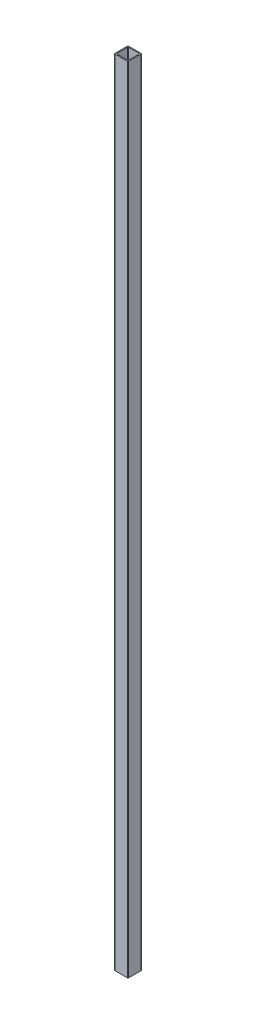
ISO-10303-21;
HEADER;
FILE_DESCRIPTION(('STEP AP214'),'2;1');
FILE_NAME('part.step','',(''),(''),'','','');
FILE_SCHEMA(('AUTOMOTIVE_DESIGN { 1 0 10303 214 1 1 1 1 }'));
ENDSEC;
DATA;
#1=APPLICATION_CONTEXT('core data for automotive mechanical design processes');
#2=APPLICATION_PROTOCOL_DEFINITION('international standard','automotive_design',2000,#1);
#3=PRODUCT_CONTEXT('',#1,'mechanical');
#4=PRODUCT('Part','Part','',(#3));
#5=PRODUCT_RELATED_PRODUCT_CATEGORY('part','',(#4));
#6=PRODUCT_DEFINITION_FORMATION('','',#4);
#7=PRODUCT_DEFINITION_CONTEXT('part definition',#1,'design');
#8=PRODUCT_DEFINITION('design','',#6,#7);
#9=PRODUCT_DEFINITION_SHAPE('','',#8);
#10=(LENGTH_UNIT() NAMED_UNIT(*) SI_UNIT(.MILLI.,.METRE.));
#11=(NAMED_UNIT(*) PLANE_ANGLE_UNIT() SI_UNIT($,.RADIAN.));
#12=(NAMED_UNIT(*) SI_UNIT($,.STERADIAN.) SOLID_ANGLE_UNIT());
#13=UNCERTAINTY_MEASURE_WITH_UNIT(LENGTH_MEASURE(1.E-05),#10,'distance_accuracy_value','');
#14=(GEOMETRIC_REPRESENTATION_CONTEXT(3) GLOBAL_UNCERTAINTY_ASSIGNED_CONTEXT((#13)) GLOBAL_UNIT_ASSIGNED_CONTEXT((#10,
#11,#12)) REPRESENTATION_CONTEXT('',''));
#15=CARTESIAN_POINT('',(0.,0.,0.));
#16=DIRECTION('',(0.,0.,1.));
#17=DIRECTION('',(1.,0.,0.));
#18=AXIS2_PLACEMENT_3D('',#15,#16,#17);
#19=CARTESIAN_POINT('',(-9.,1160.,9.));
#20=DIRECTION('',(0.,-1.,0.));
#21=DIRECTION('',(0.,0.,-1.));
#22=AXIS2_PLACEMENT_3D('',#19,#20,#21);
#23=PLANE('',#22);
#24=CARTESIAN_POINT('',(-9.,1160.,9.));
#25=DIRECTION('',(0.,1.,0.));
#26=DIRECTION('',(0.,0.,-1.));
#27=AXIS2_PLACEMENT_3D('',#24,#25,#26);
#28=CIRCLE('',#27,0.999999999999999);
#29=CARTESIAN_POINT('',(-10.,1160.,8.99999999999999));
#30=VERTEX_POINT('',#29);
#31=CARTESIAN_POINT('',(-8.99999999999999,1160.,10.));
#32=VERTEX_POINT('',#31);
#33=EDGE_CURVE('E213',#30,#32,#28,.T.);
#34=ORIENTED_EDGE('',*,*,#33,.T.);
#35=DIRECTION('',(1.,0.,0.));
#36=VECTOR('',#35,1.);
#37=CARTESIAN_POINT('',(-8.99999999999999,1160.,10.));
#38=LINE('',#37,#36);
#39=CARTESIAN_POINT('',(8.99999999999999,1160.,10.));
#40=VERTEX_POINT('',#39);
#41=EDGE_CURVE('E216',#32,#40,#38,.T.);
#42=ORIENTED_EDGE('',*,*,#41,.T.);
#43=CARTESIAN_POINT('',(9.,1160.,9.));
#44=DIRECTION('',(0.,1.,0.));
#45=DIRECTION('',(0.,0.,1.));
#46=AXIS2_PLACEMENT_3D('',#43,#44,#45);
#47=CIRCLE('',#46,0.999999999999999);
#48=CARTESIAN_POINT('',(10.,1160.,8.99999999999999));
#49=VERTEX_POINT('',#48);
#50=EDGE_CURVE('E219',#40,#49,#47,.T.);
#51=ORIENTED_EDGE('',*,*,#50,.T.);
#52=DIRECTION('',(0.,0.,-1.));
#53=VECTOR('',#52,1.);
#54=CARTESIAN_POINT('',(10.,1160.,8.99999999999999));
#55=LINE('',#54,#53);
#56=CARTESIAN_POINT('',(10.,1160.,-8.99999999999999));
#57=VERTEX_POINT('',#56);
#58=EDGE_CURVE('E221',#49,#57,#55,.T.);
#59=ORIENTED_EDGE('',*,*,#58,.T.);
#60=CARTESIAN_POINT('',(9.,1160.,-9.));
#61=DIRECTION('',(0.,1.,0.));
#62=DIRECTION('',(0.,0.,-1.));
#63=AXIS2_PLACEMENT_3D('',#60,#61,#62);
#64=CIRCLE('',#63,0.999999999999999);
#65=CARTESIAN_POINT('',(8.99999999999999,1160.,-10.));
#66=VERTEX_POINT('',#65);
#67=EDGE_CURVE('E223',#57,#66,#64,.T.);
#68=ORIENTED_EDGE('',*,*,#67,.T.);
#69=DIRECTION('',(-1.,0.,0.));
#70=VECTOR('',#69,1.);
#71=CARTESIAN_POINT('',(-8.99999999999999,1160.,-10.));
#72=LINE('',#71,#70);
#73=CARTESIAN_POINT('',(-8.99999999999999,1160.,-10.));
#74=VERTEX_POINT('',#73);
#75=EDGE_CURVE('E225',#66,#74,#72,.T.);
#76=ORIENTED_EDGE('',*,*,#75,.T.);
#77=CARTESIAN_POINT('',(-9.,1160.,-9.));
#78=DIRECTION('',(0.,1.,0.));
#79=DIRECTION('',(0.,0.,-1.));
#80=AXIS2_PLACEMENT_3D('',#77,#78,#79);
#81=CIRCLE('',#80,0.999999999999999);
#82=CARTESIAN_POINT('',(-10.,1160.,-8.99999999999999));
#83=VERTEX_POINT('',#82);
#84=EDGE_CURVE('E227',#74,#83,#81,.T.);
#85=ORIENTED_EDGE('',*,*,#84,.T.);
#86=DIRECTION('',(0.,0.,1.));
#87=VECTOR('',#86,1.);
#88=CARTESIAN_POINT('',(-10.,1160.,8.99999999999999));
#89=LINE('',#88,#87);
#90=EDGE_CURVE('E229',#83,#30,#89,.T.);
#91=ORIENTED_EDGE('',*,*,#90,.T.);
#92=EDGE_LOOP('',(#34,#42,#51,#59,#68,#76,#85,#91));
#93=FACE_BOUND('',#92,.T.);
#94=CARTESIAN_POINT('',(-7.5,1160.,7.5));
#95=DIRECTION('',(0.,1.,0.));
#96=DIRECTION('',(0.,0.,-1.));
#97=AXIS2_PLACEMENT_3D('',#94,#95,#96);
#98=CIRCLE('',#97,1.);
#99=CARTESIAN_POINT('',(-8.5,1160.,7.49999999999999));
#100=VERTEX_POINT('',#99);
#101=CARTESIAN_POINT('',(-7.5,1160.,8.5));
#102=VERTEX_POINT('',#101);
#103=EDGE_CURVE('E148',#100,#102,#98,.T.);
#104=ORIENTED_EDGE('',*,*,#103,.F.);
#105=DIRECTION('',(0.,0.,1.));
#106=VECTOR('',#105,1.);
#107=CARTESIAN_POINT('',(-8.5,1160.,7.49999999999999));
#108=LINE('',#107,#106);
#109=CARTESIAN_POINT('',(-8.5,1160.,-7.49999999999999));
#110=VERTEX_POINT('',#109);
#111=EDGE_CURVE('E181',#110,#100,#108,.T.);
#112=ORIENTED_EDGE('',*,*,#111,.F.);
#113=CARTESIAN_POINT('',(-7.5,1160.,-7.5));
#114=DIRECTION('',(0.,1.,0.));
#115=DIRECTION('',(0.,0.,-1.));
#116=AXIS2_PLACEMENT_3D('',#113,#114,#115);
#117=CIRCLE('',#116,1.);
#118=CARTESIAN_POINT('',(-7.5,1160.,-8.5));
#119=VERTEX_POINT('',#118);
#120=EDGE_CURVE('E179',#119,#110,#117,.T.);
#121=ORIENTED_EDGE('',*,*,#120,.F.);
#122=DIRECTION('',(-1.,0.,0.));
#123=VECTOR('',#122,1.);
#124=CARTESIAN_POINT('',(-7.5,1160.,-8.5));
#125=LINE('',#124,#123);
#126=CARTESIAN_POINT('',(7.49999999999999,1160.,-8.5));
#127=VERTEX_POINT('',#126);
#128=EDGE_CURVE('E177',#127,#119,#125,.T.);
#129=ORIENTED_EDGE('',*,*,#128,.F.);
#130=CARTESIAN_POINT('',(7.5,1160.,-7.5));
#131=DIRECTION('',(0.,1.,0.));
#132=DIRECTION('',(0.,0.,-1.));
#133=AXIS2_PLACEMENT_3D('',#130,#131,#132);
#134=CIRCLE('',#133,1.);
#135=CARTESIAN_POINT('',(8.5,1160.,-7.49999999999999));
#136=VERTEX_POINT('',#135);
#137=EDGE_CURVE('E175',#136,#127,#134,.T.);
#138=ORIENTED_EDGE('',*,*,#137,.F.);
#139=DIRECTION('',(0.,0.,-1.));
#140=VECTOR('',#139,1.);
#141=CARTESIAN_POINT('',(8.5,1160.,7.49999999999999));
#142=LINE('',#141,#140);
#143=CARTESIAN_POINT('',(8.5,1160.,7.49999999999999));
#144=VERTEX_POINT('',#143);
#145=EDGE_CURVE('E171',#144,#136,#142,.T.);
#146=ORIENTED_EDGE('',*,*,#145,.F.);
#147=CARTESIAN_POINT('',(7.5,1160.,7.5));
#148=DIRECTION('',(0.,1.,0.));
#149=DIRECTION('',(0.,0.,1.));
#150=AXIS2_PLACEMENT_3D('',#147,#148,#149);
#151=CIRCLE('',#150,1.);
#152=CARTESIAN_POINT('',(7.49999999999999,1160.,8.5));
#153=VERTEX_POINT('',#152);
#154=EDGE_CURVE('E169',#153,#144,#151,.T.);
#155=ORIENTED_EDGE('',*,*,#154,.F.);
#156=DIRECTION('',(1.,0.,0.));
#157=VECTOR('',#156,1.);
#158=CARTESIAN_POINT('',(-7.5,1160.,8.5));
#159=LINE('',#158,#157);
#160=EDGE_CURVE('E156',#102,#153,#159,.T.);
#161=ORIENTED_EDGE('',*,*,#160,.F.);
#162=EDGE_LOOP('',(#104,#112,#121,#129,#138,#146,#155,#161));
#163=FACE_BOUND('',#162,.T.);
#164=ADVANCED_FACE('F35',(#93,#163),#23,.F.);
#165=CARTESIAN_POINT('',(-9.,0.,9.));
#166=DIRECTION('',(0.,-1.,0.));
#167=DIRECTION('',(0.,0.,-1.));
#168=AXIS2_PLACEMENT_3D('',#165,#166,#167);
#169=PLANE('',#168);
#170=CARTESIAN_POINT('',(-9.,0.,9.));
#171=DIRECTION('',(0.,1.,0.));
#172=DIRECTION('',(0.,0.,-1.));
#173=AXIS2_PLACEMENT_3D('',#170,#171,#172);
#174=CIRCLE('',#173,0.999999999999999);
#175=CARTESIAN_POINT('',(-10.,0.,8.99999999999999));
#176=VERTEX_POINT('',#175);
#177=CARTESIAN_POINT('',(-8.99999999999999,0.,10.));
#178=VERTEX_POINT('',#177);
#179=EDGE_CURVE('E164',#176,#178,#174,.T.);
#180=ORIENTED_EDGE('',*,*,#179,.F.);
#181=DIRECTION('',(0.,0.,1.));
#182=VECTOR('',#181,1.);
#183=CARTESIAN_POINT('',(-10.,0.,8.99999999999999));
#184=LINE('',#183,#182);
#185=CARTESIAN_POINT('',(-10.,0.,-8.99999999999999));
#186=VERTEX_POINT('',#185);
#187=EDGE_CURVE('E217',#186,#176,#184,.T.);
#188=ORIENTED_EDGE('',*,*,#187,.F.);
#189=CARTESIAN_POINT('',(-9.,0.,-9.));
#190=DIRECTION('',(0.,1.,0.));
#191=DIRECTION('',(0.,0.,-1.));
#192=AXIS2_PLACEMENT_3D('',#189,#190,#191);
#193=CIRCLE('',#192,0.999999999999999);
#194=CARTESIAN_POINT('',(-8.99999999999999,0.,-10.));
#195=VERTEX_POINT('',#194);
#196=EDGE_CURVE('E244',#195,#186,#193,.T.);
#197=ORIENTED_EDGE('',*,*,#196,.F.);
#198=DIRECTION('',(-1.,0.,0.));
#199=VECTOR('',#198,1.);
#200=CARTESIAN_POINT('',(-8.99999999999999,0.,-10.));
#201=LINE('',#200,#199);
#202=CARTESIAN_POINT('',(8.99999999999999,0.,-10.));
#203=VERTEX_POINT('',#202);
#204=EDGE_CURVE('E242',#203,#195,#201,.T.);
#205=ORIENTED_EDGE('',*,*,#204,.F.);
#206=CARTESIAN_POINT('',(9.,0.,-9.));
#207=DIRECTION('',(0.,1.,0.));
#208=DIRECTION('',(0.,0.,-1.));
#209=AXIS2_PLACEMENT_3D('',#206,#207,#208);
#210=CIRCLE('',#209,0.999999999999999);
#211=CARTESIAN_POINT('',(10.,0.,-8.99999999999999));
#212=VERTEX_POINT('',#211);
#213=EDGE_CURVE('E240',#212,#203,#210,.T.);
#214=ORIENTED_EDGE('',*,*,#213,.F.);
#215=DIRECTION('',(0.,0.,-1.));
#216=VECTOR('',#215,1.);
#217=CARTESIAN_POINT('',(10.,0.,8.99999999999999));
#218=LINE('',#217,#216);
#219=CARTESIAN_POINT('',(10.,0.,8.99999999999999));
#220=VERTEX_POINT('',#219);
#221=EDGE_CURVE('E238',#220,#212,#218,.T.);
#222=ORIENTED_EDGE('',*,*,#221,.F.);
#223=CARTESIAN_POINT('',(9.,0.,9.));
#224=DIRECTION('',(0.,1.,0.));
#225=DIRECTION('',(0.,0.,1.));
#226=AXIS2_PLACEMENT_3D('',#223,#224,#225);
#227=CIRCLE('',#226,0.999999999999999);
#228=CARTESIAN_POINT('',(8.99999999999999,0.,10.));
#229=VERTEX_POINT('',#228);
#230=EDGE_CURVE('E236',#229,#220,#227,.T.);
#231=ORIENTED_EDGE('',*,*,#230,.F.);
#232=DIRECTION('',(1.,0.,0.));
#233=VECTOR('',#232,1.);
#234=CARTESIAN_POINT('',(-8.99999999999999,0.,10.));
#235=LINE('',#234,#233);
#236=EDGE_CURVE('E234',#178,#229,#235,.T.);
#237=ORIENTED_EDGE('',*,*,#236,.F.);
#238=EDGE_LOOP('',(#180,#188,#197,#205,#214,#222,#231,#237));
#239=FACE_BOUND('',#238,.T.);
#240=DIRECTION('',(0.,0.,1.));
#241=VECTOR('',#240,1.);
#242=CARTESIAN_POINT('',(-8.5,0.,7.49999999999999));
#243=LINE('',#242,#241);
#244=CARTESIAN_POINT('',(-8.5,0.,-7.49999999999999));
#245=VERTEX_POINT('',#244);
#246=CARTESIAN_POINT('',(-8.5,0.,7.49999999999999));
#247=VERTEX_POINT('',#246);
#248=EDGE_CURVE('E157',#245,#247,#243,.T.);
#249=ORIENTED_EDGE('',*,*,#248,.T.);
#250=CARTESIAN_POINT('',(-7.5,0.,7.5));
#251=DIRECTION('',(0.,1.,0.));
#252=DIRECTION('',(0.,0.,-1.));
#253=AXIS2_PLACEMENT_3D('',#250,#251,#252);
#254=CIRCLE('',#253,1.);
#255=CARTESIAN_POINT('',(-7.5,0.,8.5));
#256=VERTEX_POINT('',#255);
#257=EDGE_CURVE('E58',#247,#256,#254,.T.);
#258=ORIENTED_EDGE('',*,*,#257,.T.);
#259=DIRECTION('',(1.,0.,0.));
#260=VECTOR('',#259,1.);
#261=CARTESIAN_POINT('',(-7.5,0.,8.5));
#262=LINE('',#261,#260);
#263=CARTESIAN_POINT('',(7.49999999999999,0.,8.5));
#264=VERTEX_POINT('',#263);
#265=EDGE_CURVE('E163',#256,#264,#262,.T.);
#266=ORIENTED_EDGE('',*,*,#265,.T.);
#267=CARTESIAN_POINT('',(7.5,0.,7.5));
#268=DIRECTION('',(0.,1.,0.));
#269=DIRECTION('',(0.,0.,1.));
#270=AXIS2_PLACEMENT_3D('',#267,#268,#269);
#271=CIRCLE('',#270,1.);
#272=CARTESIAN_POINT('',(8.5,0.,7.49999999999999));
#273=VERTEX_POINT('',#272);
#274=EDGE_CURVE('E185',#264,#273,#271,.T.);
#275=ORIENTED_EDGE('',*,*,#274,.T.);
#276=DIRECTION('',(0.,0.,-1.));
#277=VECTOR('',#276,1.);
#278=CARTESIAN_POINT('',(8.5,0.,7.49999999999999));
#279=LINE('',#278,#277);
#280=CARTESIAN_POINT('',(8.5,0.,-7.49999999999999));
#281=VERTEX_POINT('',#280);
#282=EDGE_CURVE('E188',#273,#281,#279,.T.);
#283=ORIENTED_EDGE('',*,*,#282,.T.);
#284=CARTESIAN_POINT('',(7.5,0.,-7.5));
#285=DIRECTION('',(0.,1.,0.));
#286=DIRECTION('',(0.,0.,-1.));
#287=AXIS2_PLACEMENT_3D('',#284,#285,#286);
#288=CIRCLE('',#287,1.);
#289=CARTESIAN_POINT('',(7.49999999999999,0.,-8.5));
#290=VERTEX_POINT('',#289);
#291=EDGE_CURVE('E191',#281,#290,#288,.T.);
#292=ORIENTED_EDGE('',*,*,#291,.T.);
#293=DIRECTION('',(-1.,0.,0.));
#294=VECTOR('',#293,1.);
#295=CARTESIAN_POINT('',(-7.5,0.,-8.5));
#296=LINE('',#295,#294);
#297=CARTESIAN_POINT('',(-7.5,0.,-8.5));
#298=VERTEX_POINT('',#297);
#299=EDGE_CURVE('E194',#290,#298,#296,.T.);
#300=ORIENTED_EDGE('',*,*,#299,.T.);
#301=CARTESIAN_POINT('',(-7.5,0.,-7.5));
#302=DIRECTION('',(0.,1.,0.));
#303=DIRECTION('',(0.,0.,-1.));
#304=AXIS2_PLACEMENT_3D('',#301,#302,#303);
#305=CIRCLE('',#304,1.);
#306=EDGE_CURVE('E197',#298,#245,#305,.T.);
#307=ORIENTED_EDGE('',*,*,#306,.T.);
#308=EDGE_LOOP('',(#249,#258,#266,#275,#283,#292,#300,#307));
#309=FACE_BOUND('',#308,.T.);
#310=ADVANCED_FACE('F274',(#239,#309),#169,.T.);
#311=CARTESIAN_POINT('',(-9.,1160.,9.));
#312=DIRECTION('',(0.,-1.,0.));
#313=DIRECTION('',(0.,0.,-1.));
#314=AXIS2_PLACEMENT_3D('',#311,#312,#313);
#315=CYLINDRICAL_SURFACE('',#314,0.999999999999999);
#316=ORIENTED_EDGE('',*,*,#179,.T.);
#317=DIRECTION('',(0.,-1.,0.));
#318=VECTOR('',#317,1.);
#319=CARTESIAN_POINT('',(-8.99999999999999,1160.,10.));
#320=LINE('',#319,#318);
#321=EDGE_CURVE('E11',#32,#178,#320,.T.);
#322=ORIENTED_EDGE('',*,*,#321,.F.);
#323=ORIENTED_EDGE('',*,*,#33,.F.);
#324=DIRECTION('',(0.,-1.,0.));
#325=VECTOR('',#324,1.);
#326=CARTESIAN_POINT('',(-10.,1160.,8.99999999999999));
#327=LINE('',#326,#325);
#328=EDGE_CURVE('E231',#30,#176,#327,.T.);
#329=ORIENTED_EDGE('',*,*,#328,.T.);
#330=EDGE_LOOP('',(#316,#322,#323,#329));
#331=FACE_BOUND('',#330,.T.);
#332=ADVANCED_FACE('F37',(#331),#315,.T.);
#333=CARTESIAN_POINT('',(-8.99999999999999,1160.,10.));
#334=DIRECTION('',(0.,0.,-1.));
#335=DIRECTION('',(-1.,0.,0.));
#336=AXIS2_PLACEMENT_3D('',#333,#334,#335);
#337=PLANE('',#336);
#338=ORIENTED_EDGE('',*,*,#236,.T.);
#339=DIRECTION('',(0.,-1.,0.));
#340=VECTOR('',#339,1.);
#341=CARTESIAN_POINT('',(8.99999999999999,1160.,10.));
#342=LINE('',#341,#340);
#343=EDGE_CURVE('E43',#40,#229,#342,.T.);
#344=ORIENTED_EDGE('',*,*,#343,.F.);
#345=ORIENTED_EDGE('',*,*,#41,.F.);
#346=ORIENTED_EDGE('',*,*,#321,.T.);
#347=EDGE_LOOP('',(#338,#344,#345,#346));
#348=FACE_BOUND('',#347,.T.);
#349=ADVANCED_FACE('F291',(#348),#337,.F.);
#350=CARTESIAN_POINT('',(9.,1160.,9.));
#351=DIRECTION('',(0.,-1.,0.));
#352=DIRECTION('',(0.,0.,-1.));
#353=AXIS2_PLACEMENT_3D('',#350,#351,#352);
#354=CYLINDRICAL_SURFACE('',#353,0.999999999999999);
#355=ORIENTED_EDGE('',*,*,#230,.T.);
#356=DIRECTION('',(0.,-1.,0.));
#357=VECTOR('',#356,1.);
#358=CARTESIAN_POINT('',(10.,1160.,8.99999999999999));
#359=LINE('',#358,#357);
#360=EDGE_CURVE('E261',#49,#220,#359,.T.);
#361=ORIENTED_EDGE('',*,*,#360,.F.);
#362=ORIENTED_EDGE('',*,*,#50,.F.);
#363=ORIENTED_EDGE('',*,*,#343,.T.);
#364=EDGE_LOOP('',(#355,#361,#362,#363));
#365=FACE_BOUND('',#364,.T.);
#366=ADVANCED_FACE('F268',(#365),#354,.T.);
#367=CARTESIAN_POINT('',(10.,1160.,8.99999999999999));
#368=DIRECTION('',(-1.,0.,0.));
#369=DIRECTION('',(0.,0.,1.));
#370=AXIS2_PLACEMENT_3D('',#367,#368,#369);
#371=PLANE('',#370);
#372=ORIENTED_EDGE('',*,*,#221,.T.);
#373=DIRECTION('',(0.,-1.,0.));
#374=VECTOR('',#373,1.);
#375=CARTESIAN_POINT('',(10.,1160.,-8.99999999999999));
#376=LINE('',#375,#374);
#377=EDGE_CURVE('E258',#57,#212,#376,.T.);
#378=ORIENTED_EDGE('',*,*,#377,.F.);
#379=ORIENTED_EDGE('',*,*,#58,.F.);
#380=ORIENTED_EDGE('',*,*,#360,.T.);
#381=EDGE_LOOP('',(#372,#378,#379,#380));
#382=FACE_BOUND('',#381,.T.);
#383=ADVANCED_FACE('F280',(#382),#371,.F.);
#384=CARTESIAN_POINT('',(9.,1160.,-9.));
#385=DIRECTION('',(0.,-1.,0.));
#386=DIRECTION('',(0.,0.,-1.));
#387=AXIS2_PLACEMENT_3D('',#384,#385,#386);
#388=CYLINDRICAL_SURFACE('',#387,0.999999999999999);
#389=ORIENTED_EDGE('',*,*,#213,.T.);
#390=DIRECTION('',(0.,-1.,0.));
#391=VECTOR('',#390,1.);
#392=CARTESIAN_POINT('',(8.99999999999999,1160.,-10.));
#393=LINE('',#392,#391);
#394=EDGE_CURVE('E255',#66,#203,#393,.T.);
#395=ORIENTED_EDGE('',*,*,#394,.F.);
#396=ORIENTED_EDGE('',*,*,#67,.F.);
#397=ORIENTED_EDGE('',*,*,#377,.T.);
#398=EDGE_LOOP('',(#389,#395,#396,#397));
#399=FACE_BOUND('',#398,.T.);
#400=ADVANCED_FACE('F284',(#399),#388,.T.);
#401=CARTESIAN_POINT('',(-8.99999999999999,1160.,-10.));
#402=DIRECTION('',(0.,0.,1.));
#403=DIRECTION('',(1.,0.,0.));
#404=AXIS2_PLACEMENT_3D('',#401,#402,#403);
#405=PLANE('',#404);
#406=ORIENTED_EDGE('',*,*,#204,.T.);
#407=DIRECTION('',(0.,-1.,0.));
#408=VECTOR('',#407,1.);
#409=CARTESIAN_POINT('',(-8.99999999999999,1160.,-10.));
#410=LINE('',#409,#408);
#411=EDGE_CURVE('E252',#74,#195,#410,.T.);
#412=ORIENTED_EDGE('',*,*,#411,.F.);
#413=ORIENTED_EDGE('',*,*,#75,.F.);
#414=ORIENTED_EDGE('',*,*,#394,.T.);
#415=EDGE_LOOP('',(#406,#412,#413,#414));
#416=FACE_BOUND('',#415,.T.);
#417=ADVANCED_FACE('F304',(#416),#405,.F.);
#418=CARTESIAN_POINT('',(-9.,1160.,-9.));
#419=DIRECTION('',(0.,-1.,0.));
#420=DIRECTION('',(0.,0.,-1.));
#421=AXIS2_PLACEMENT_3D('',#418,#419,#420);
#422=CYLINDRICAL_SURFACE('',#421,0.999999999999999);
#423=ORIENTED_EDGE('',*,*,#196,.T.);
#424=DIRECTION('',(0.,-1.,0.));
#425=VECTOR('',#424,1.);
#426=CARTESIAN_POINT('',(-10.,1160.,-8.99999999999999));
#427=LINE('',#426,#425);
#428=EDGE_CURVE('E249',#83,#186,#427,.T.);
#429=ORIENTED_EDGE('',*,*,#428,.F.);
#430=ORIENTED_EDGE('',*,*,#84,.F.);
#431=ORIENTED_EDGE('',*,*,#411,.T.);
#432=EDGE_LOOP('',(#423,#429,#430,#431));
#433=FACE_BOUND('',#432,.T.);
#434=ADVANCED_FACE('F302',(#433),#422,.T.);
#435=CARTESIAN_POINT('',(-10.,1160.,8.99999999999999));
#436=DIRECTION('',(1.,0.,0.));
#437=DIRECTION('',(0.,0.,-1.));
#438=AXIS2_PLACEMENT_3D('',#435,#436,#437);
#439=PLANE('',#438);
#440=ORIENTED_EDGE('',*,*,#187,.T.);
#441=ORIENTED_EDGE('',*,*,#328,.F.);
#442=ORIENTED_EDGE('',*,*,#90,.F.);
#443=ORIENTED_EDGE('',*,*,#428,.T.);
#444=EDGE_LOOP('',(#440,#441,#442,#443));
#445=FACE_BOUND('',#444,.T.);
#446=ADVANCED_FACE('F297',(#445),#439,.F.);
#447=CARTESIAN_POINT('',(-7.5,1160.,7.5));
#448=DIRECTION('',(0.,-1.,0.));
#449=DIRECTION('',(0.,0.,-1.));
#450=AXIS2_PLACEMENT_3D('',#447,#448,#449);
#451=CYLINDRICAL_SURFACE('',#450,1.);
#452=ORIENTED_EDGE('',*,*,#257,.F.);
#453=DIRECTION('',(0.,-1.,0.));
#454=VECTOR('',#453,1.);
#455=CARTESIAN_POINT('',(-8.5,1160.,7.49999999999999));
#456=LINE('',#455,#454);
#457=EDGE_CURVE('E152',#100,#247,#456,.T.);
#458=ORIENTED_EDGE('',*,*,#457,.F.);
#459=ORIENTED_EDGE('',*,*,#103,.T.);
#460=DIRECTION('',(0.,-1.,0.));
#461=VECTOR('',#460,1.);
#462=CARTESIAN_POINT('',(-7.5,1160.,8.5));
#463=LINE('',#462,#461);
#464=EDGE_CURVE('E151',#102,#256,#463,.T.);
#465=ORIENTED_EDGE('',*,*,#464,.T.);
#466=EDGE_LOOP('',(#452,#458,#459,#465));
#467=FACE_BOUND('',#466,.T.);
#468=ADVANCED_FACE('F150',(#467),#451,.F.);
#469=CARTESIAN_POINT('',(-7.5,1160.,8.5));
#470=DIRECTION('',(0.,0.,-1.));
#471=DIRECTION('',(-1.,0.,0.));
#472=AXIS2_PLACEMENT_3D('',#469,#470,#471);
#473=PLANE('',#472);
#474=ORIENTED_EDGE('',*,*,#265,.F.);
#475=ORIENTED_EDGE('',*,*,#464,.F.);
#476=ORIENTED_EDGE('',*,*,#160,.T.);
#477=DIRECTION('',(0.,-1.,0.));
#478=VECTOR('',#477,1.);
#479=CARTESIAN_POINT('',(7.49999999999999,1160.,8.5));
#480=LINE('',#479,#478);
#481=EDGE_CURVE('E165',#153,#264,#480,.T.);
#482=ORIENTED_EDGE('',*,*,#481,.T.);
#483=EDGE_LOOP('',(#474,#475,#476,#482));
#484=FACE_BOUND('',#483,.T.);
#485=ADVANCED_FACE('F160',(#484),#473,.T.);
#486=CARTESIAN_POINT('',(7.5,1160.,7.5));
#487=DIRECTION('',(0.,-1.,0.));
#488=DIRECTION('',(0.,0.,-1.));
#489=AXIS2_PLACEMENT_3D('',#486,#487,#488);
#490=CYLINDRICAL_SURFACE('',#489,1.);
#491=ORIENTED_EDGE('',*,*,#274,.F.);
#492=ORIENTED_EDGE('',*,*,#481,.F.);
#493=ORIENTED_EDGE('',*,*,#154,.T.);
#494=DIRECTION('',(0.,-1.,0.));
#495=VECTOR('',#494,1.);
#496=CARTESIAN_POINT('',(8.5,1160.,7.49999999999999));
#497=LINE('',#496,#495);
#498=EDGE_CURVE('E210',#144,#273,#497,.T.);
#499=ORIENTED_EDGE('',*,*,#498,.T.);
#500=EDGE_LOOP('',(#491,#492,#493,#499));
#501=FACE_BOUND('',#500,.T.);
#502=ADVANCED_FACE('F329',(#501),#490,.F.);
#503=CARTESIAN_POINT('',(8.5,1160.,7.49999999999999));
#504=DIRECTION('',(-1.,0.,0.));
#505=DIRECTION('',(0.,0.,1.));
#506=AXIS2_PLACEMENT_3D('',#503,#504,#505);
#507=PLANE('',#506);
#508=ORIENTED_EDGE('',*,*,#282,.F.);
#509=ORIENTED_EDGE('',*,*,#498,.F.);
#510=ORIENTED_EDGE('',*,*,#145,.T.);
#511=DIRECTION('',(0.,-1.,0.));
#512=VECTOR('',#511,1.);
#513=CARTESIAN_POINT('',(8.5,1160.,-7.49999999999999));
#514=LINE('',#513,#512);
#515=EDGE_CURVE('E208',#136,#281,#514,.T.);
#516=ORIENTED_EDGE('',*,*,#515,.T.);
#517=EDGE_LOOP('',(#508,#509,#510,#516));
#518=FACE_BOUND('',#517,.T.);
#519=ADVANCED_FACE('F333',(#518),#507,.T.);
#520=CARTESIAN_POINT('',(7.5,1160.,-7.5));
#521=DIRECTION('',(0.,-1.,0.));
#522=DIRECTION('',(0.,0.,-1.));
#523=AXIS2_PLACEMENT_3D('',#520,#521,#522);
#524=CYLINDRICAL_SURFACE('',#523,1.);
#525=ORIENTED_EDGE('',*,*,#291,.F.);
#526=ORIENTED_EDGE('',*,*,#515,.F.);
#527=ORIENTED_EDGE('',*,*,#137,.T.);
#528=DIRECTION('',(0.,-1.,0.));
#529=VECTOR('',#528,1.);
#530=CARTESIAN_POINT('',(7.49999999999999,1160.,-8.5));
#531=LINE('',#530,#529);
#532=EDGE_CURVE('E206',#127,#290,#531,.T.);
#533=ORIENTED_EDGE('',*,*,#532,.T.);
#534=EDGE_LOOP('',(#525,#526,#527,#533));
#535=FACE_BOUND('',#534,.T.);
#536=ADVANCED_FACE('F339',(#535),#524,.F.);
#537=CARTESIAN_POINT('',(-7.5,1160.,-8.5));
#538=DIRECTION('',(0.,0.,1.));
#539=DIRECTION('',(1.,0.,0.));
#540=AXIS2_PLACEMENT_3D('',#537,#538,#539);
#541=PLANE('',#540);
#542=ORIENTED_EDGE('',*,*,#299,.F.);
#543=ORIENTED_EDGE('',*,*,#532,.F.);
#544=ORIENTED_EDGE('',*,*,#128,.T.);
#545=DIRECTION('',(0.,-1.,0.));
#546=VECTOR('',#545,1.);
#547=CARTESIAN_POINT('',(-7.5,1160.,-8.5));
#548=LINE('',#547,#546);
#549=EDGE_CURVE('E204',#119,#298,#548,.T.);
#550=ORIENTED_EDGE('',*,*,#549,.T.);
#551=EDGE_LOOP('',(#542,#543,#544,#550));
#552=FACE_BOUND('',#551,.T.);
#553=ADVANCED_FACE('F343',(#552),#541,.T.);
#554=CARTESIAN_POINT('',(-7.5,1160.,-7.5));
#555=DIRECTION('',(0.,-1.,0.));
#556=DIRECTION('',(0.,0.,-1.));
#557=AXIS2_PLACEMENT_3D('',#554,#555,#556);
#558=CYLINDRICAL_SURFACE('',#557,1.);
#559=ORIENTED_EDGE('',*,*,#306,.F.);
#560=ORIENTED_EDGE('',*,*,#549,.F.);
#561=ORIENTED_EDGE('',*,*,#120,.T.);
#562=DIRECTION('',(0.,-1.,0.));
#563=VECTOR('',#562,1.);
#564=CARTESIAN_POINT('',(-8.5,1160.,-7.49999999999999));
#565=LINE('',#564,#563);
#566=EDGE_CURVE('E50',#110,#245,#565,.T.);
#567=ORIENTED_EDGE('',*,*,#566,.T.);
#568=EDGE_LOOP('',(#559,#560,#561,#567));
#569=FACE_BOUND('',#568,.T.);
#570=ADVANCED_FACE('F347',(#569),#558,.F.);
#571=CARTESIAN_POINT('',(-8.5,1160.,7.49999999999999));
#572=DIRECTION('',(1.,0.,0.));
#573=DIRECTION('',(0.,0.,-1.));
#574=AXIS2_PLACEMENT_3D('',#571,#572,#573);
#575=PLANE('',#574);
#576=ORIENTED_EDGE('',*,*,#248,.F.);
#577=ORIENTED_EDGE('',*,*,#566,.F.);
#578=ORIENTED_EDGE('',*,*,#111,.T.);
#579=ORIENTED_EDGE('',*,*,#457,.T.);
#580=EDGE_LOOP('',(#576,#577,#578,#579));
#581=FACE_BOUND('',#580,.T.);
#582=ADVANCED_FACE('F351',(#581),#575,.T.);
#583=CLOSED_SHELL('',(#164,#310,#332,#349,#366,#383,#400,#417,#434,#446,#468,#485,#502,#519,
#536,#553,#570,#582));
#584=MANIFOLD_SOLID_BREP('B2',#583);
#585=ADVANCED_BREP_SHAPE_REPRESENTATION('',(#18,#584),#14);
#586=SHAPE_DEFINITION_REPRESENTATION(#9,#585);
ENDSEC;
END-ISO-10303-21;
